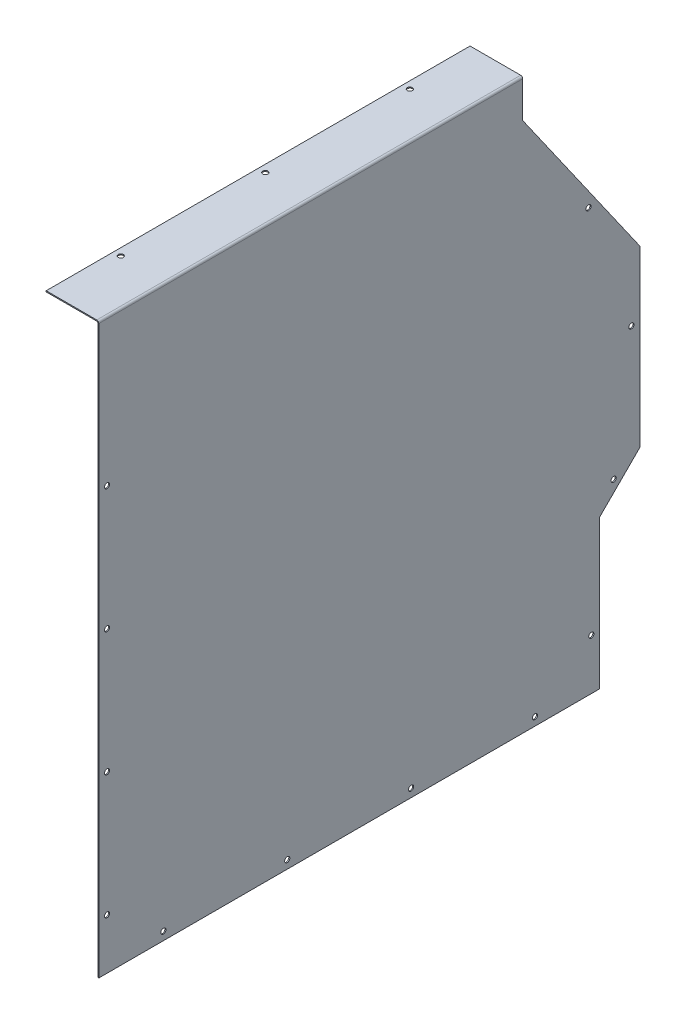
ISO-10303-21;
HEADER;
FILE_DESCRIPTION(('STEP AP214'),'2;1');
FILE_NAME('part.step','',(''),(''),'','','');
FILE_SCHEMA(('AUTOMOTIVE_DESIGN { 1 0 10303 214 1 1 1 1 }'));
ENDSEC;
DATA;
#1=APPLICATION_CONTEXT('core data for automotive mechanical design processes');
#2=APPLICATION_PROTOCOL_DEFINITION('international standard','automotive_design',2000,#1);
#3=PRODUCT_CONTEXT('',#1,'mechanical');
#4=PRODUCT('Part','Part','',(#3));
#5=PRODUCT_RELATED_PRODUCT_CATEGORY('part','',(#4));
#6=PRODUCT_DEFINITION_FORMATION('','',#4);
#7=PRODUCT_DEFINITION_CONTEXT('part definition',#1,'design');
#8=PRODUCT_DEFINITION('design','',#6,#7);
#9=PRODUCT_DEFINITION_SHAPE('','',#8);
#10=(LENGTH_UNIT() NAMED_UNIT(*) SI_UNIT(.MILLI.,.METRE.));
#11=(NAMED_UNIT(*) PLANE_ANGLE_UNIT() SI_UNIT($,.RADIAN.));
#12=(NAMED_UNIT(*) SI_UNIT($,.STERADIAN.) SOLID_ANGLE_UNIT());
#13=UNCERTAINTY_MEASURE_WITH_UNIT(LENGTH_MEASURE(1.E-05),#10,'distance_accuracy_value','');
#14=(GEOMETRIC_REPRESENTATION_CONTEXT(3) GLOBAL_UNCERTAINTY_ASSIGNED_CONTEXT((#13)) GLOBAL_UNIT_ASSIGNED_CONTEXT((#10,
#11,#12)) REPRESENTATION_CONTEXT('',''));
#15=CARTESIAN_POINT('',(0.,0.,0.));
#16=DIRECTION('',(0.,0.,1.));
#17=DIRECTION('',(1.,0.,0.));
#18=AXIS2_PLACEMENT_3D('',#15,#16,#17);
#19=CARTESIAN_POINT('',(1.,-275.5,262.));
#20=DIRECTION('',(0.,0.,-1.));
#21=DIRECTION('',(-1.,0.,0.));
#22=AXIS2_PLACEMENT_3D('',#19,#20,#21);
#23=PLANE('',#22);
#24=DIRECTION('',(1.,0.,0.));
#25=VECTOR('',#24,1.);
#26=CARTESIAN_POINT('',(0.,273.5,262.));
#27=LINE('',#26,#25);
#28=CARTESIAN_POINT('',(0.,273.5,262.));
#29=VERTEX_POINT('',#28);
#30=CARTESIAN_POINT('',(1.,273.5,262.));
#31=VERTEX_POINT('',#30);
#32=EDGE_CURVE('E160',#29,#31,#27,.T.);
#33=ORIENTED_EDGE('',*,*,#32,.F.);
#34=DIRECTION('',(0.,-1.,0.));
#35=VECTOR('',#34,1.);
#36=CARTESIAN_POINT('',(0.,-275.5,262.));
#37=LINE('',#36,#35);
#38=CARTESIAN_POINT('',(0.,-275.5,262.));
#39=VERTEX_POINT('',#38);
#40=EDGE_CURVE('E157',#29,#39,#37,.T.);
#41=ORIENTED_EDGE('',*,*,#40,.T.);
#42=DIRECTION('',(-1.,0.,0.));
#43=VECTOR('',#42,1.);
#44=CARTESIAN_POINT('',(1.,-275.5,262.));
#45=LINE('',#44,#43);
#46=CARTESIAN_POINT('',(1.,-275.5,262.));
#47=VERTEX_POINT('',#46);
#48=EDGE_CURVE('E13',#47,#39,#45,.T.);
#49=ORIENTED_EDGE('',*,*,#48,.F.);
#50=DIRECTION('',(0.,-1.,0.));
#51=VECTOR('',#50,1.);
#52=CARTESIAN_POINT('',(1.,-275.5,262.));
#53=LINE('',#52,#51);
#54=EDGE_CURVE('E117',#31,#47,#53,.T.);
#55=ORIENTED_EDGE('',*,*,#54,.F.);
#56=EDGE_LOOP('',(#33,#41,#49,#55));
#57=FACE_BOUND('',#56,.T.);
#58=ADVANCED_FACE('F59',(#57),#23,.F.);
#59=CARTESIAN_POINT('',(1.,238.5,-148.566378810027));
#60=DIRECTION('',(0.,0.,1.));
#61=DIRECTION('',(1.,0.,0.));
#62=AXIS2_PLACEMENT_3D('',#59,#60,#61);
#63=PLANE('',#62);
#64=DIRECTION('',(1.,0.,0.));
#65=VECTOR('',#64,1.);
#66=CARTESIAN_POINT('',(0.,273.5,-148.566378810027));
#67=LINE('',#66,#65);
#68=CARTESIAN_POINT('',(0.,273.5,-148.566378810027));
#69=VERTEX_POINT('',#68);
#70=CARTESIAN_POINT('',(0.999999999999997,273.5,-148.566378810027));
#71=VERTEX_POINT('',#70);
#72=EDGE_CURVE('E187',#69,#71,#67,.T.);
#73=ORIENTED_EDGE('',*,*,#72,.T.);
#74=DIRECTION('',(0.,1.,0.));
#75=VECTOR('',#74,1.);
#76=CARTESIAN_POINT('',(1.,238.5,-148.566378810027));
#77=LINE('',#76,#75);
#78=CARTESIAN_POINT('',(1.,238.5,-148.566378810027));
#79=VERTEX_POINT('',#78);
#80=EDGE_CURVE('E151',#79,#71,#77,.T.);
#81=ORIENTED_EDGE('',*,*,#80,.F.);
#82=DIRECTION('',(-1.,0.,0.));
#83=VECTOR('',#82,1.);
#84=CARTESIAN_POINT('',(1.,238.5,-148.566378810027));
#85=LINE('',#84,#83);
#86=CARTESIAN_POINT('',(0.,238.5,-148.566378810027));
#87=VERTEX_POINT('',#86);
#88=EDGE_CURVE('E156',#79,#87,#85,.T.);
#89=ORIENTED_EDGE('',*,*,#88,.T.);
#90=DIRECTION('',(0.,1.,0.));
#91=VECTOR('',#90,1.);
#92=CARTESIAN_POINT('',(0.,238.5,-148.566378810027));
#93=LINE('',#92,#91);
#94=EDGE_CURVE('E168',#87,#69,#93,.T.);
#95=ORIENTED_EDGE('',*,*,#94,.T.);
#96=EDGE_LOOP('',(#73,#81,#89,#95));
#97=FACE_BOUND('',#96,.T.);
#98=ADVANCED_FACE('F184',(#97),#63,.F.);
#99=CARTESIAN_POINT('',(1.,0.,0.));
#100=DIRECTION('',(-1.,0.,0.));
#101=DIRECTION('',(0.,0.,1.));
#102=AXIS2_PLACEMENT_3D('',#99,#100,#101);
#103=PLANE('',#102);
#104=CARTESIAN_POINT('',(1.,13.5000000000021,253.999999999999));
#105=DIRECTION('',(-1.,0.,0.));
#106=DIRECTION('',(0.,0.,1.));
#107=AXIS2_PLACEMENT_3D('',#104,#105,#106);
#108=CIRCLE('',#107,2.49999999999996);
#109=CARTESIAN_POINT('',(1.,13.5000000000021,256.499999999999));
#110=VERTEX_POINT('',#109);
#111=EDGE_CURVE('E386',#110,#110,#108,.F.);
#112=ORIENTED_EDGE('',*,*,#111,.F.);
#113=EDGE_LOOP('',(#112));
#114=FACE_BOUND('',#113,.T.);
#115=CARTESIAN_POINT('',(1.,-106.499999999998,253.999999999999));
#116=DIRECTION('',(-1.,0.,0.));
#117=DIRECTION('',(0.,0.,1.));
#118=AXIS2_PLACEMENT_3D('',#115,#116,#117);
#119=CIRCLE('',#118,2.49999999999997);
#120=CARTESIAN_POINT('',(1.,-106.499999999998,256.499999999999));
#121=VERTEX_POINT('',#120);
#122=EDGE_CURVE('E418',#121,#121,#119,.F.);
#123=ORIENTED_EDGE('',*,*,#122,.F.);
#124=EDGE_LOOP('',(#123));
#125=FACE_BOUND('',#124,.T.);
#126=CARTESIAN_POINT('',(1.,-226.499999999998,253.999999999999));
#127=DIRECTION('',(-1.,0.,0.));
#128=DIRECTION('',(0.,0.,1.));
#129=AXIS2_PLACEMENT_3D('',#126,#127,#128);
#130=CIRCLE('',#129,2.49999999999996);
#131=CARTESIAN_POINT('',(1.,-226.499999999998,256.499999999999));
#132=VERTEX_POINT('',#131);
#133=EDGE_CURVE('E414',#132,#132,#130,.F.);
#134=ORIENTED_EDGE('',*,*,#133,.F.);
#135=EDGE_LOOP('',(#134));
#136=FACE_BOUND('',#135,.T.);
#137=CARTESIAN_POINT('',(1.,-267.499999999996,199.5));
#138=DIRECTION('',(-1.,0.,0.));
#139=DIRECTION('',(0.,0.,1.));
#140=AXIS2_PLACEMENT_3D('',#137,#138,#139);
#141=CIRCLE('',#140,2.5);
#142=CARTESIAN_POINT('',(1.,-267.499999999996,202.));
#143=VERTEX_POINT('',#142);
#144=EDGE_CURVE('E410',#143,#143,#141,.F.);
#145=ORIENTED_EDGE('',*,*,#144,.F.);
#146=EDGE_LOOP('',(#145));
#147=FACE_BOUND('',#146,.T.);
#148=CARTESIAN_POINT('',(1.,-267.499999999996,79.5000000000002));
#149=DIRECTION('',(-1.,0.,0.));
#150=DIRECTION('',(0.,0.,1.));
#151=AXIS2_PLACEMENT_3D('',#148,#149,#150);
#152=CIRCLE('',#151,2.49999999999997);
#153=CARTESIAN_POINT('',(1.,-267.499999999996,82.0000000000002));
#154=VERTEX_POINT('',#153);
#155=EDGE_CURVE('E406',#154,#154,#152,.F.);
#156=ORIENTED_EDGE('',*,*,#155,.F.);
#157=EDGE_LOOP('',(#156));
#158=FACE_BOUND('',#157,.T.);
#159=CARTESIAN_POINT('',(1.,-267.499999999996,-40.4999999999998));
#160=DIRECTION('',(-1.,0.,0.));
#161=DIRECTION('',(0.,0.,1.));
#162=AXIS2_PLACEMENT_3D('',#159,#160,#161);
#163=CIRCLE('',#162,2.5);
#164=CARTESIAN_POINT('',(1.,-267.499999999996,-37.9999999999998));
#165=VERTEX_POINT('',#164);
#166=EDGE_CURVE('E402',#165,#165,#163,.F.);
#167=ORIENTED_EDGE('',*,*,#166,.F.);
#168=EDGE_LOOP('',(#167));
#169=FACE_BOUND('',#168,.T.);
#170=CARTESIAN_POINT('',(1.,-267.499999999996,-160.5));
#171=DIRECTION('',(-1.,0.,0.));
#172=DIRECTION('',(0.,0.,1.));
#173=AXIS2_PLACEMENT_3D('',#170,#171,#172);
#174=CIRCLE('',#173,2.5);
#175=CARTESIAN_POINT('',(1.,-267.499999999996,-158.));
#176=VERTEX_POINT('',#175);
#177=EDGE_CURVE('E398',#176,#176,#174,.F.);
#178=ORIENTED_EDGE('',*,*,#177,.F.);
#179=EDGE_LOOP('',(#178));
#180=FACE_BOUND('',#179,.T.);
#181=CARTESIAN_POINT('',(1.,-106.5,-236.686291501008));
#182=DIRECTION('',(-1.,0.,0.));
#183=DIRECTION('',(0.,0.,1.));
#184=AXIS2_PLACEMENT_3D('',#181,#182,#183);
#185=CIRCLE('',#184,2.50000000000226);
#186=CARTESIAN_POINT('',(1.,-106.5,-234.186291501005));
#187=VERTEX_POINT('',#186);
#188=EDGE_CURVE('E393',#187,#187,#185,.F.);
#189=ORIENTED_EDGE('',*,*,#188,.F.);
#190=EDGE_LOOP('',(#189));
#191=FACE_BOUND('',#190,.T.);
#192=CARTESIAN_POINT('',(1.,-226.5,-214.999999999991));
#193=DIRECTION('',(-1.,0.,0.));
#194=DIRECTION('',(0.,0.,1.));
#195=AXIS2_PLACEMENT_3D('',#192,#193,#194);
#196=CIRCLE('',#195,2.500000000002);
#197=CARTESIAN_POINT('',(1.,-226.5,-212.499999999989));
#198=VERTEX_POINT('',#197);
#199=EDGE_CURVE('E397',#198,#198,#196,.F.);
#200=ORIENTED_EDGE('',*,*,#199,.F.);
#201=EDGE_LOOP('',(#200));
#202=FACE_BOUND('',#201,.T.);
#203=CARTESIAN_POINT('',(1.,13.4999999999995,-253.890872965255));
#204=DIRECTION('',(-1.,0.,0.));
#205=DIRECTION('',(0.,0.,1.));
#206=AXIS2_PLACEMENT_3D('',#203,#204,#205);
#207=CIRCLE('',#206,2.50000000000246);
#208=CARTESIAN_POINT('',(1.,13.4999999999995,-251.390872965253));
#209=VERTEX_POINT('',#208);
#210=EDGE_CURVE('E428',#209,#209,#207,.F.);
#211=ORIENTED_EDGE('',*,*,#210,.F.);
#212=EDGE_LOOP('',(#211));
#213=FACE_BOUND('',#212,.T.);
#214=CARTESIAN_POINT('',(1.,133.500000000002,-212.321973611953));
#215=DIRECTION('',(-1.,0.,0.));
#216=DIRECTION('',(0.,0.,1.));
#217=AXIS2_PLACEMENT_3D('',#214,#215,#216);
#218=CIRCLE('',#217,2.50000000000049);
#219=CARTESIAN_POINT('',(1.,133.500000000002,-209.821973611953));
#220=VERTEX_POINT('',#219);
#221=EDGE_CURVE('E423',#220,#220,#218,.F.);
#222=ORIENTED_EDGE('',*,*,#221,.F.);
#223=EDGE_LOOP('',(#222));
#224=FACE_BOUND('',#223,.T.);
#225=CARTESIAN_POINT('',(1.,133.500000000002,253.999999999999));
#226=DIRECTION('',(-1.,0.,0.));
#227=DIRECTION('',(0.,0.,1.));
#228=AXIS2_PLACEMENT_3D('',#225,#226,#227);
#229=CIRCLE('',#228,2.49999999999996);
#230=CARTESIAN_POINT('',(1.,133.500000000002,256.499999999999));
#231=VERTEX_POINT('',#230);
#232=EDGE_CURVE('E254',#231,#231,#229,.F.);
#233=ORIENTED_EDGE('',*,*,#232,.F.);
#234=EDGE_LOOP('',(#233));
#235=FACE_BOUND('',#234,.T.);
#236=DIRECTION('',(0.,0.,-1.));
#237=VECTOR('',#236,1.);
#238=CARTESIAN_POINT('',(0.999999999999997,273.5,-148.566378810027));
#239=LINE('',#238,#237);
#240=EDGE_CURVE('E189',#71,#31,#239,.F.);
#241=ORIENTED_EDGE('',*,*,#240,.T.);
#242=ORIENTED_EDGE('',*,*,#54,.T.);
#243=DIRECTION('',(0.,0.,-1.));
#244=VECTOR('',#243,1.);
#245=CARTESIAN_POINT('',(1.,-275.5,262.));
#246=LINE('',#245,#244);
#247=CARTESIAN_POINT('',(1.,-275.5,-223.));
#248=VERTEX_POINT('',#247);
#249=EDGE_CURVE('E267',#47,#248,#246,.T.);
#250=ORIENTED_EDGE('',*,*,#249,.T.);
#251=DIRECTION('',(0.,1.,0.));
#252=VECTOR('',#251,1.);
#253=CARTESIAN_POINT('',(1.,-275.5,-223.));
#254=LINE('',#253,#252);
#255=CARTESIAN_POINT('',(1.,-131.5,-223.));
#256=VERTEX_POINT('',#255);
#257=EDGE_CURVE('E134',#248,#256,#254,.T.);
#258=ORIENTED_EDGE('',*,*,#257,.T.);
#259=DIRECTION('',(0.,0.707106781186546,-0.707106781186549));
#260=VECTOR('',#259,1.);
#261=CARTESIAN_POINT('',(1.,-131.5,-223.));
#262=LINE('',#261,#260);
#263=CARTESIAN_POINT('',(1.,-92.5000000000001,-262.));
#264=VERTEX_POINT('',#263);
#265=EDGE_CURVE('E127',#256,#264,#262,.T.);
#266=ORIENTED_EDGE('',*,*,#265,.T.);
#267=DIRECTION('',(0.,1.,0.));
#268=VECTOR('',#267,1.);
#269=CARTESIAN_POINT('',(1.,-92.5000000000001,-262.));
#270=LINE('',#269,#268);
#271=CARTESIAN_POINT('',(1.,76.5,-262.));
#272=VERTEX_POINT('',#271);
#273=EDGE_CURVE('E131',#264,#272,#270,.T.);
#274=ORIENTED_EDGE('',*,*,#273,.T.);
#275=DIRECTION('',(0.,0.819152044288991,0.573576436351048));
#276=VECTOR('',#275,1.);
#277=CARTESIAN_POINT('',(1.,76.5,-262.));
#278=LINE('',#277,#276);
#279=EDGE_CURVE('E82',#272,#79,#278,.T.);
#280=ORIENTED_EDGE('',*,*,#279,.T.);
#281=ORIENTED_EDGE('',*,*,#80,.T.);
#282=EDGE_LOOP('',(#241,#242,#250,#258,#266,#274,#280,#281));
#283=FACE_BOUND('',#282,.T.);
#284=ADVANCED_FACE('F129',(#114,#125,#136,#147,#158,#169,#180,#191,#202,#213,#224,#235,#283),
#103,.F.);
#285=CARTESIAN_POINT('',(0.,0.,0.));
#286=DIRECTION('',(-1.,0.,0.));
#287=DIRECTION('',(0.,0.,1.));
#288=AXIS2_PLACEMENT_3D('',#285,#286,#287);
#289=PLANE('',#288);
#290=CARTESIAN_POINT('',(0.,13.5000000000021,253.999999999999));
#291=DIRECTION('',(-1.,0.,0.));
#292=DIRECTION('',(0.,0.,1.));
#293=AXIS2_PLACEMENT_3D('',#290,#291,#292);
#294=CIRCLE('',#293,2.49999999999996);
#295=CARTESIAN_POINT('',(0.,13.5000000000021,256.499999999999));
#296=VERTEX_POINT('',#295);
#297=EDGE_CURVE('E341',#296,#296,#294,.T.);
#298=ORIENTED_EDGE('',*,*,#297,.F.);
#299=EDGE_LOOP('',(#298));
#300=FACE_BOUND('',#299,.T.);
#301=CARTESIAN_POINT('',(0.,-106.499999999998,253.999999999999));
#302=DIRECTION('',(-1.,0.,0.));
#303=DIRECTION('',(0.,0.,1.));
#304=AXIS2_PLACEMENT_3D('',#301,#302,#303);
#305=CIRCLE('',#304,2.49999999999997);
#306=CARTESIAN_POINT('',(0.,-106.499999999998,256.499999999999));
#307=VERTEX_POINT('',#306);
#308=EDGE_CURVE('E345',#307,#307,#305,.T.);
#309=ORIENTED_EDGE('',*,*,#308,.F.);
#310=EDGE_LOOP('',(#309));
#311=FACE_BOUND('',#310,.T.);
#312=CARTESIAN_POINT('',(0.,-226.499999999998,253.999999999999));
#313=DIRECTION('',(-1.,0.,0.));
#314=DIRECTION('',(0.,0.,1.));
#315=AXIS2_PLACEMENT_3D('',#312,#313,#314);
#316=CIRCLE('',#315,2.49999999999996);
#317=CARTESIAN_POINT('',(0.,-226.499999999998,256.499999999999));
#318=VERTEX_POINT('',#317);
#319=EDGE_CURVE('E349',#318,#318,#316,.T.);
#320=ORIENTED_EDGE('',*,*,#319,.F.);
#321=EDGE_LOOP('',(#320));
#322=FACE_BOUND('',#321,.T.);
#323=CARTESIAN_POINT('',(0.,-267.499999999996,199.5));
#324=DIRECTION('',(-1.,0.,0.));
#325=DIRECTION('',(0.,0.,1.));
#326=AXIS2_PLACEMENT_3D('',#323,#324,#325);
#327=CIRCLE('',#326,2.5);
#328=CARTESIAN_POINT('',(0.,-267.499999999996,202.));
#329=VERTEX_POINT('',#328);
#330=EDGE_CURVE('E353',#329,#329,#327,.T.);
#331=ORIENTED_EDGE('',*,*,#330,.F.);
#332=EDGE_LOOP('',(#331));
#333=FACE_BOUND('',#332,.T.);
#334=CARTESIAN_POINT('',(0.,-267.499999999996,79.5000000000002));
#335=DIRECTION('',(-1.,0.,0.));
#336=DIRECTION('',(0.,0.,1.));
#337=AXIS2_PLACEMENT_3D('',#334,#335,#336);
#338=CIRCLE('',#337,2.49999999999997);
#339=CARTESIAN_POINT('',(0.,-267.499999999996,82.0000000000002));
#340=VERTEX_POINT('',#339);
#341=EDGE_CURVE('E357',#340,#340,#338,.T.);
#342=ORIENTED_EDGE('',*,*,#341,.F.);
#343=EDGE_LOOP('',(#342));
#344=FACE_BOUND('',#343,.T.);
#345=CARTESIAN_POINT('',(0.,-267.499999999996,-40.4999999999998));
#346=DIRECTION('',(-1.,0.,0.));
#347=DIRECTION('',(0.,0.,1.));
#348=AXIS2_PLACEMENT_3D('',#345,#346,#347);
#349=CIRCLE('',#348,2.5);
#350=CARTESIAN_POINT('',(0.,-267.499999999996,-37.9999999999998));
#351=VERTEX_POINT('',#350);
#352=EDGE_CURVE('E361',#351,#351,#349,.T.);
#353=ORIENTED_EDGE('',*,*,#352,.F.);
#354=EDGE_LOOP('',(#353));
#355=FACE_BOUND('',#354,.T.);
#356=CARTESIAN_POINT('',(0.,-267.499999999996,-160.5));
#357=DIRECTION('',(-1.,0.,0.));
#358=DIRECTION('',(0.,0.,1.));
#359=AXIS2_PLACEMENT_3D('',#356,#357,#358);
#360=CIRCLE('',#359,2.5);
#361=CARTESIAN_POINT('',(0.,-267.499999999996,-158.));
#362=VERTEX_POINT('',#361);
#363=EDGE_CURVE('E365',#362,#362,#360,.T.);
#364=ORIENTED_EDGE('',*,*,#363,.F.);
#365=EDGE_LOOP('',(#364));
#366=FACE_BOUND('',#365,.T.);
#367=CARTESIAN_POINT('',(0.,-106.5,-236.686291501008));
#368=DIRECTION('',(-1.,0.,0.));
#369=DIRECTION('',(0.,0.,1.));
#370=AXIS2_PLACEMENT_3D('',#367,#368,#369);
#371=CIRCLE('',#370,2.50000000000226);
#372=CARTESIAN_POINT('',(0.,-106.5,-234.186291501005));
#373=VERTEX_POINT('',#372);
#374=EDGE_CURVE('E369',#373,#373,#371,.T.);
#375=ORIENTED_EDGE('',*,*,#374,.F.);
#376=EDGE_LOOP('',(#375));
#377=FACE_BOUND('',#376,.T.);
#378=CARTESIAN_POINT('',(0.,-226.5,-214.999999999991));
#379=DIRECTION('',(-1.,0.,0.));
#380=DIRECTION('',(0.,0.,1.));
#381=AXIS2_PLACEMENT_3D('',#378,#379,#380);
#382=CIRCLE('',#381,2.500000000002);
#383=CARTESIAN_POINT('',(0.,-226.5,-212.499999999989));
#384=VERTEX_POINT('',#383);
#385=EDGE_CURVE('E373',#384,#384,#382,.T.);
#386=ORIENTED_EDGE('',*,*,#385,.F.);
#387=EDGE_LOOP('',(#386));
#388=FACE_BOUND('',#387,.T.);
#389=CARTESIAN_POINT('',(0.,13.4999999999995,-253.890872965255));
#390=DIRECTION('',(-1.,0.,0.));
#391=DIRECTION('',(0.,0.,1.));
#392=AXIS2_PLACEMENT_3D('',#389,#390,#391);
#393=CIRCLE('',#392,2.50000000000246);
#394=CARTESIAN_POINT('',(0.,13.4999999999995,-251.390872965253));
#395=VERTEX_POINT('',#394);
#396=EDGE_CURVE('E377',#395,#395,#393,.T.);
#397=ORIENTED_EDGE('',*,*,#396,.F.);
#398=EDGE_LOOP('',(#397));
#399=FACE_BOUND('',#398,.T.);
#400=CARTESIAN_POINT('',(0.,133.500000000002,-212.321973611953));
#401=DIRECTION('',(-1.,0.,0.));
#402=DIRECTION('',(0.,0.,1.));
#403=AXIS2_PLACEMENT_3D('',#400,#401,#402);
#404=CIRCLE('',#403,2.50000000000049);
#405=CARTESIAN_POINT('',(0.,133.500000000002,-209.821973611953));
#406=VERTEX_POINT('',#405);
#407=EDGE_CURVE('E381',#406,#406,#404,.T.);
#408=ORIENTED_EDGE('',*,*,#407,.F.);
#409=EDGE_LOOP('',(#408));
#410=FACE_BOUND('',#409,.T.);
#411=CARTESIAN_POINT('',(0.,133.500000000002,253.999999999999));
#412=DIRECTION('',(-1.,0.,0.));
#413=DIRECTION('',(0.,0.,1.));
#414=AXIS2_PLACEMENT_3D('',#411,#412,#413);
#415=CIRCLE('',#414,2.49999999999996);
#416=CARTESIAN_POINT('',(0.,133.500000000002,256.499999999999));
#417=VERTEX_POINT('',#416);
#418=EDGE_CURVE('E384',#417,#417,#415,.T.);
#419=ORIENTED_EDGE('',*,*,#418,.F.);
#420=EDGE_LOOP('',(#419));
#421=FACE_BOUND('',#420,.T.);
#422=ORIENTED_EDGE('',*,*,#40,.F.);
#423=DIRECTION('',(0.,0.,-1.));
#424=VECTOR('',#423,1.);
#425=CARTESIAN_POINT('',(0.,273.5,-148.566378810027));
#426=LINE('',#425,#424);
#427=EDGE_CURVE('E73',#69,#29,#426,.F.);
#428=ORIENTED_EDGE('',*,*,#427,.F.);
#429=ORIENTED_EDGE('',*,*,#94,.F.);
#430=DIRECTION('',(0.,0.819152044288991,0.573576436351048));
#431=VECTOR('',#430,1.);
#432=CARTESIAN_POINT('',(0.,76.5,-262.));
#433=LINE('',#432,#431);
#434=CARTESIAN_POINT('',(0.,76.5,-262.));
#435=VERTEX_POINT('',#434);
#436=EDGE_CURVE('E109',#435,#87,#433,.T.);
#437=ORIENTED_EDGE('',*,*,#436,.F.);
#438=DIRECTION('',(0.,1.,0.));
#439=VECTOR('',#438,1.);
#440=CARTESIAN_POINT('',(0.,-92.5000000000001,-262.));
#441=LINE('',#440,#439);
#442=CARTESIAN_POINT('',(0.,-92.5000000000001,-262.));
#443=VERTEX_POINT('',#442);
#444=EDGE_CURVE('E165',#443,#435,#441,.T.);
#445=ORIENTED_EDGE('',*,*,#444,.F.);
#446=DIRECTION('',(0.,0.707106781186546,-0.707106781186549));
#447=VECTOR('',#446,1.);
#448=CARTESIAN_POINT('',(0.,-131.5,-223.));
#449=LINE('',#448,#447);
#450=CARTESIAN_POINT('',(0.,-131.5,-223.));
#451=VERTEX_POINT('',#450);
#452=EDGE_CURVE('E143',#451,#443,#449,.T.);
#453=ORIENTED_EDGE('',*,*,#452,.F.);
#454=DIRECTION('',(0.,1.,0.));
#455=VECTOR('',#454,1.);
#456=CARTESIAN_POINT('',(0.,-275.5,-223.));
#457=LINE('',#456,#455);
#458=CARTESIAN_POINT('',(0.,-275.5,-223.));
#459=VERTEX_POINT('',#458);
#460=EDGE_CURVE('E162',#459,#451,#457,.T.);
#461=ORIENTED_EDGE('',*,*,#460,.F.);
#462=DIRECTION('',(0.,0.,-1.));
#463=VECTOR('',#462,1.);
#464=CARTESIAN_POINT('',(0.,-275.5,262.));
#465=LINE('',#464,#463);
#466=EDGE_CURVE('E159',#39,#459,#465,.T.);
#467=ORIENTED_EDGE('',*,*,#466,.F.);
#468=EDGE_LOOP('',(#422,#428,#429,#437,#445,#453,#461,#467));
#469=FACE_BOUND('',#468,.T.);
#470=ADVANCED_FACE('F179',(#300,#311,#322,#333,#344,#355,#366,#377,#388,#399,#410,#421,#469),
#289,.T.);
#471=CARTESIAN_POINT('',(1.,-275.5,262.));
#472=DIRECTION('',(0.,1.,0.));
#473=DIRECTION('',(0.,0.,1.));
#474=AXIS2_PLACEMENT_3D('',#471,#472,#473);
#475=PLANE('',#474);
#476=ORIENTED_EDGE('',*,*,#466,.T.);
#477=DIRECTION('',(-1.,0.,0.));
#478=VECTOR('',#477,1.);
#479=CARTESIAN_POINT('',(1.,-275.5,-223.));
#480=LINE('',#479,#478);
#481=EDGE_CURVE('E66',#248,#459,#480,.T.);
#482=ORIENTED_EDGE('',*,*,#481,.F.);
#483=ORIENTED_EDGE('',*,*,#249,.F.);
#484=ORIENTED_EDGE('',*,*,#48,.T.);
#485=EDGE_LOOP('',(#476,#482,#483,#484));
#486=FACE_BOUND('',#485,.T.);
#487=ADVANCED_FACE('F269',(#486),#475,.F.);
#488=CARTESIAN_POINT('',(1.,-275.5,-223.));
#489=DIRECTION('',(0.,0.,1.));
#490=DIRECTION('',(1.,0.,0.));
#491=AXIS2_PLACEMENT_3D('',#488,#489,#490);
#492=PLANE('',#491);
#493=ORIENTED_EDGE('',*,*,#460,.T.);
#494=DIRECTION('',(-1.,0.,0.));
#495=VECTOR('',#494,1.);
#496=CARTESIAN_POINT('',(1.,-131.5,-223.));
#497=LINE('',#496,#495);
#498=EDGE_CURVE('E146',#256,#451,#497,.T.);
#499=ORIENTED_EDGE('',*,*,#498,.F.);
#500=ORIENTED_EDGE('',*,*,#257,.F.);
#501=ORIENTED_EDGE('',*,*,#481,.T.);
#502=EDGE_LOOP('',(#493,#499,#500,#501));
#503=FACE_BOUND('',#502,.T.);
#504=ADVANCED_FACE('F176',(#503),#492,.F.);
#505=CARTESIAN_POINT('',(1.,-131.5,-223.));
#506=DIRECTION('',(0.,0.707106781186549,0.707106781186546));
#507=DIRECTION('',(0.,-0.707106781186546,0.707106781186549));
#508=AXIS2_PLACEMENT_3D('',#505,#506,#507);
#509=PLANE('',#508);
#510=ORIENTED_EDGE('',*,*,#452,.T.);
#511=DIRECTION('',(-1.,0.,0.));
#512=VECTOR('',#511,1.);
#513=CARTESIAN_POINT('',(1.,-92.5000000000001,-262.));
#514=LINE('',#513,#512);
#515=EDGE_CURVE('E140',#264,#443,#514,.T.);
#516=ORIENTED_EDGE('',*,*,#515,.F.);
#517=ORIENTED_EDGE('',*,*,#265,.F.);
#518=ORIENTED_EDGE('',*,*,#498,.T.);
#519=EDGE_LOOP('',(#510,#516,#517,#518));
#520=FACE_BOUND('',#519,.T.);
#521=ADVANCED_FACE('F141',(#520),#509,.F.);
#522=CARTESIAN_POINT('',(1.,-92.5000000000001,-262.));
#523=DIRECTION('',(0.,0.,1.));
#524=DIRECTION('',(1.,0.,0.));
#525=AXIS2_PLACEMENT_3D('',#522,#523,#524);
#526=PLANE('',#525);
#527=ORIENTED_EDGE('',*,*,#444,.T.);
#528=DIRECTION('',(-1.,0.,0.));
#529=VECTOR('',#528,1.);
#530=CARTESIAN_POINT('',(1.,76.5,-262.));
#531=LINE('',#530,#529);
#532=EDGE_CURVE('E147',#272,#435,#531,.T.);
#533=ORIENTED_EDGE('',*,*,#532,.F.);
#534=ORIENTED_EDGE('',*,*,#273,.F.);
#535=ORIENTED_EDGE('',*,*,#515,.T.);
#536=EDGE_LOOP('',(#527,#533,#534,#535));
#537=FACE_BOUND('',#536,.T.);
#538=ADVANCED_FACE('F149',(#537),#526,.F.);
#539=CARTESIAN_POINT('',(1.,76.5,-262.));
#540=DIRECTION('',(0.,-0.573576436351048,0.819152044288991));
#541=DIRECTION('',(0.,-0.819152044288991,-0.573576436351048));
#542=AXIS2_PLACEMENT_3D('',#539,#540,#541);
#543=PLANE('',#542);
#544=ORIENTED_EDGE('',*,*,#436,.T.);
#545=ORIENTED_EDGE('',*,*,#88,.F.);
#546=ORIENTED_EDGE('',*,*,#279,.F.);
#547=ORIENTED_EDGE('',*,*,#532,.T.);
#548=EDGE_LOOP('',(#544,#545,#546,#547));
#549=FACE_BOUND('',#548,.T.);
#550=ADVANCED_FACE('F180',(#549),#543,.F.);
#551=CARTESIAN_POINT('',(-1.,273.5,262.));
#552=DIRECTION('',(0.,0.,1.));
#553=DIRECTION('',(1.,0.,0.));
#554=AXIS2_PLACEMENT_3D('',#551,#552,#553);
#555=PLANE('',#554);
#556=DIRECTION('',(0.,-1.,0.));
#557=VECTOR('',#556,1.);
#558=CARTESIAN_POINT('',(-0.999999999999998,275.5,262.));
#559=LINE('',#558,#557);
#560=CARTESIAN_POINT('',(-1.,274.5,262.));
#561=VERTEX_POINT('',#560);
#562=CARTESIAN_POINT('',(-0.999999999999997,275.5,262.));
#563=VERTEX_POINT('',#562);
#564=EDGE_CURVE('E219',#561,#563,#559,.F.);
#565=ORIENTED_EDGE('',*,*,#564,.F.);
#566=CARTESIAN_POINT('',(-1.,273.5,262.));
#567=DIRECTION('',(0.,0.,-1.));
#568=DIRECTION('',(-1.,0.,0.));
#569=AXIS2_PLACEMENT_3D('',#566,#567,#568);
#570=CIRCLE('',#569,1.);
#571=EDGE_CURVE('E213',#29,#561,#570,.F.);
#572=ORIENTED_EDGE('',*,*,#571,.F.);
#573=ORIENTED_EDGE('',*,*,#32,.T.);
#574=CARTESIAN_POINT('',(-1.,273.5,262.));
#575=DIRECTION('',(0.,0.,-1.));
#576=DIRECTION('',(-1.,0.,0.));
#577=AXIS2_PLACEMENT_3D('',#574,#575,#576);
#578=CIRCLE('',#577,2.);
#579=EDGE_CURVE('E256',#31,#563,#578,.F.);
#580=ORIENTED_EDGE('',*,*,#579,.T.);
#581=EDGE_LOOP('',(#565,#572,#573,#580));
#582=FACE_BOUND('',#581,.T.);
#583=ADVANCED_FACE('F272',(#582),#555,.T.);
#584=CARTESIAN_POINT('',(-1.,273.5,-148.566378810027));
#585=DIRECTION('',(0.,0.,1.));
#586=DIRECTION('',(1.,0.,0.));
#587=AXIS2_PLACEMENT_3D('',#584,#585,#586);
#588=PLANE('',#587);
#589=CARTESIAN_POINT('',(-1.,273.5,-148.566378810027));
#590=DIRECTION('',(0.,0.,-1.));
#591=DIRECTION('',(-1.,0.,0.));
#592=AXIS2_PLACEMENT_3D('',#589,#590,#591);
#593=CIRCLE('',#592,1.);
#594=CARTESIAN_POINT('',(-1.,274.5,-148.566378810027));
#595=VERTEX_POINT('',#594);
#596=EDGE_CURVE('E211',#595,#69,#593,.T.);
#597=ORIENTED_EDGE('',*,*,#596,.F.);
#598=DIRECTION('',(0.,-1.,0.));
#599=VECTOR('',#598,1.);
#600=CARTESIAN_POINT('',(-1.,274.5,-148.566378810027));
#601=LINE('',#600,#599);
#602=CARTESIAN_POINT('',(-0.999999999999998,275.5,-148.566378810027));
#603=VERTEX_POINT('',#602);
#604=EDGE_CURVE('E218',#595,#603,#601,.F.);
#605=ORIENTED_EDGE('',*,*,#604,.T.);
#606=CARTESIAN_POINT('',(-1.,273.5,-148.566378810027));
#607=DIRECTION('',(0.,0.,-1.));
#608=DIRECTION('',(-1.,0.,0.));
#609=AXIS2_PLACEMENT_3D('',#606,#607,#608);
#610=CIRCLE('',#609,2.);
#611=EDGE_CURVE('E257',#603,#71,#610,.T.);
#612=ORIENTED_EDGE('',*,*,#611,.T.);
#613=ORIENTED_EDGE('',*,*,#72,.F.);
#614=EDGE_LOOP('',(#597,#605,#612,#613));
#615=FACE_BOUND('',#614,.T.);
#616=ADVANCED_FACE('F224',(#615),#588,.F.);
#617=CARTESIAN_POINT('',(-1.,273.5,-148.566378810027));
#618=DIRECTION('',(0.,0.,-1.));
#619=DIRECTION('',(0.,1.,0.));
#620=AXIS2_PLACEMENT_3D('',#617,#618,#619);
#621=CYLINDRICAL_SURFACE('',#620,2.);
#622=ORIENTED_EDGE('',*,*,#240,.F.);
#623=ORIENTED_EDGE('',*,*,#611,.F.);
#624=DIRECTION('',(0.,0.,-1.));
#625=VECTOR('',#624,1.);
#626=CARTESIAN_POINT('',(-0.999999999999998,275.5,262.));
#627=LINE('',#626,#625);
#628=EDGE_CURVE('E240',#603,#563,#627,.F.);
#629=ORIENTED_EDGE('',*,*,#628,.T.);
#630=ORIENTED_EDGE('',*,*,#579,.F.);
#631=EDGE_LOOP('',(#622,#623,#629,#630));
#632=FACE_BOUND('',#631,.T.);
#633=ADVANCED_FACE('F302',(#632),#621,.T.);
#634=CARTESIAN_POINT('',(-1.,273.5,-148.566378810027));
#635=DIRECTION('',(0.,0.,-1.));
#636=DIRECTION('',(0.,1.,0.));
#637=AXIS2_PLACEMENT_3D('',#634,#635,#636);
#638=CYLINDRICAL_SURFACE('',#637,1.);
#639=ORIENTED_EDGE('',*,*,#427,.T.);
#640=ORIENTED_EDGE('',*,*,#571,.T.);
#641=DIRECTION('',(0.,0.,-1.));
#642=VECTOR('',#641,1.);
#643=CARTESIAN_POINT('',(-1.,274.5,262.));
#644=LINE('',#643,#642);
#645=EDGE_CURVE('E208',#561,#595,#644,.T.);
#646=ORIENTED_EDGE('',*,*,#645,.T.);
#647=ORIENTED_EDGE('',*,*,#596,.T.);
#648=EDGE_LOOP('',(#639,#640,#646,#647));
#649=FACE_BOUND('',#648,.T.);
#650=ADVANCED_FACE('F210',(#649),#638,.F.);
#651=CARTESIAN_POINT('',(-50.,275.5,-148.566378810027));
#652=DIRECTION('',(0.,0.,1.));
#653=DIRECTION('',(1.,0.,0.));
#654=AXIS2_PLACEMENT_3D('',#651,#652,#653);
#655=PLANE('',#654);
#656=ORIENTED_EDGE('',*,*,#604,.F.);
#657=DIRECTION('',(1.,0.,0.));
#658=VECTOR('',#657,1.);
#659=CARTESIAN_POINT('',(-50.,274.5,-148.566378810027));
#660=LINE('',#659,#658);
#661=CARTESIAN_POINT('',(-50.,274.5,-148.566378810027));
#662=VERTEX_POINT('',#661);
#663=EDGE_CURVE('E236',#595,#662,#660,.F.);
#664=ORIENTED_EDGE('',*,*,#663,.T.);
#665=DIRECTION('',(0.,-1.,0.));
#666=VECTOR('',#665,1.);
#667=CARTESIAN_POINT('',(-50.,275.5,-148.566378810027));
#668=LINE('',#667,#666);
#669=CARTESIAN_POINT('',(-50.,275.5,-148.566378810027));
#670=VERTEX_POINT('',#669);
#671=EDGE_CURVE('E228',#670,#662,#668,.T.);
#672=ORIENTED_EDGE('',*,*,#671,.F.);
#673=DIRECTION('',(-1.,0.,0.));
#674=VECTOR('',#673,1.);
#675=CARTESIAN_POINT('',(1.58085806895183E-12,275.5,-148.566378810027));
#676=LINE('',#675,#674);
#677=EDGE_CURVE('E239',#603,#670,#676,.T.);
#678=ORIENTED_EDGE('',*,*,#677,.F.);
#679=EDGE_LOOP('',(#656,#664,#672,#678));
#680=FACE_BOUND('',#679,.T.);
#681=ADVANCED_FACE('F233',(#680),#655,.F.);
#682=CARTESIAN_POINT('',(0.,275.5,262.));
#683=DIRECTION('',(0.,0.,-1.));
#684=DIRECTION('',(-1.,0.,0.));
#685=AXIS2_PLACEMENT_3D('',#682,#683,#684);
#686=PLANE('',#685);
#687=ORIENTED_EDGE('',*,*,#564,.T.);
#688=DIRECTION('',(1.,0.,0.));
#689=VECTOR('',#688,1.);
#690=CARTESIAN_POINT('',(9.21090811191535E-13,275.5,262.));
#691=LINE('',#690,#689);
#692=CARTESIAN_POINT('',(-50.,275.5,262.));
#693=VERTEX_POINT('',#692);
#694=EDGE_CURVE('E279',#693,#563,#691,.T.);
#695=ORIENTED_EDGE('',*,*,#694,.F.);
#696=DIRECTION('',(0.,-1.,0.));
#697=VECTOR('',#696,1.);
#698=CARTESIAN_POINT('',(-50.,275.5,262.));
#699=LINE('',#698,#697);
#700=CARTESIAN_POINT('',(-50.,274.5,262.));
#701=VERTEX_POINT('',#700);
#702=EDGE_CURVE('E286',#693,#701,#699,.T.);
#703=ORIENTED_EDGE('',*,*,#702,.T.);
#704=DIRECTION('',(-1.,0.,0.));
#705=VECTOR('',#704,1.);
#706=CARTESIAN_POINT('',(0.,274.5,262.));
#707=LINE('',#706,#705);
#708=EDGE_CURVE('E247',#701,#561,#707,.F.);
#709=ORIENTED_EDGE('',*,*,#708,.T.);
#710=EDGE_LOOP('',(#687,#695,#703,#709));
#711=FACE_BOUND('',#710,.T.);
#712=ADVANCED_FACE('F277',(#711),#686,.F.);
#713=CARTESIAN_POINT('',(9.21090811191535E-13,275.5,0.));
#714=DIRECTION('',(0.,-1.,0.));
#715=DIRECTION('',(1.,0.,0.));
#716=AXIS2_PLACEMENT_3D('',#713,#714,#715);
#717=PLANE('',#716);
#718=CARTESIAN_POINT('',(-43.,275.5,196.716810594987));
#719=DIRECTION('',(0.,1.,0.));
#720=DIRECTION('',(-1.,0.,0.));
#721=AXIS2_PLACEMENT_3D('',#718,#719,#720);
#722=CIRCLE('',#721,2.5);
#723=CARTESIAN_POINT('',(-45.5,275.5,196.716810594987));
#724=VERTEX_POINT('',#723);
#725=EDGE_CURVE('E427',#724,#724,#722,.T.);
#726=ORIENTED_EDGE('',*,*,#725,.F.);
#727=EDGE_LOOP('',(#726));
#728=FACE_BOUND('',#727,.T.);
#729=CARTESIAN_POINT('',(-43.,275.5,56.7168105949866));
#730=DIRECTION('',(0.,1.,0.));
#731=DIRECTION('',(-1.,0.,0.));
#732=AXIS2_PLACEMENT_3D('',#729,#730,#731);
#733=CIRCLE('',#732,2.5);
#734=CARTESIAN_POINT('',(-45.5,275.5,56.7168105949866));
#735=VERTEX_POINT('',#734);
#736=EDGE_CURVE('E444',#735,#735,#733,.T.);
#737=ORIENTED_EDGE('',*,*,#736,.F.);
#738=EDGE_LOOP('',(#737));
#739=FACE_BOUND('',#738,.T.);
#740=CARTESIAN_POINT('',(-43.,275.5,-83.2831894050134));
#741=DIRECTION('',(0.,1.,0.));
#742=DIRECTION('',(-1.,0.,0.));
#743=AXIS2_PLACEMENT_3D('',#740,#741,#742);
#744=CIRCLE('',#743,2.5);
#745=CARTESIAN_POINT('',(-45.5,275.5,-83.2831894050134));
#746=VERTEX_POINT('',#745);
#747=EDGE_CURVE('E438',#746,#746,#744,.T.);
#748=ORIENTED_EDGE('',*,*,#747,.F.);
#749=EDGE_LOOP('',(#748));
#750=FACE_BOUND('',#749,.T.);
#751=ORIENTED_EDGE('',*,*,#628,.F.);
#752=ORIENTED_EDGE('',*,*,#677,.T.);
#753=DIRECTION('',(0.,0.,1.));
#754=VECTOR('',#753,1.);
#755=CARTESIAN_POINT('',(-50.,275.5,0.));
#756=LINE('',#755,#754);
#757=EDGE_CURVE('E284',#670,#693,#756,.T.);
#758=ORIENTED_EDGE('',*,*,#757,.T.);
#759=ORIENTED_EDGE('',*,*,#694,.T.);
#760=EDGE_LOOP('',(#751,#752,#758,#759));
#761=FACE_BOUND('',#760,.T.);
#762=ADVANCED_FACE('F282',(#728,#739,#750,#761),#717,.F.);
#763=CARTESIAN_POINT('',(9.17599329852692E-13,274.5,0.));
#764=DIRECTION('',(0.,-1.,0.));
#765=DIRECTION('',(1.,0.,0.));
#766=AXIS2_PLACEMENT_3D('',#763,#764,#765);
#767=PLANE('',#766);
#768=CARTESIAN_POINT('',(-43.,274.5,196.716810594987));
#769=DIRECTION('',(0.,-1.,0.));
#770=DIRECTION('',(1.,0.,0.));
#771=AXIS2_PLACEMENT_3D('',#768,#769,#770);
#772=CIRCLE('',#771,2.5);
#773=CARTESIAN_POINT('',(-40.5,274.5,196.716810594987));
#774=VERTEX_POINT('',#773);
#775=EDGE_CURVE('E447',#774,#774,#772,.F.);
#776=ORIENTED_EDGE('',*,*,#775,.T.);
#777=EDGE_LOOP('',(#776));
#778=FACE_BOUND('',#777,.T.);
#779=CARTESIAN_POINT('',(-43.,274.5,56.7168105949866));
#780=DIRECTION('',(0.,-1.,0.));
#781=DIRECTION('',(1.,0.,0.));
#782=AXIS2_PLACEMENT_3D('',#779,#780,#781);
#783=CIRCLE('',#782,2.5);
#784=CARTESIAN_POINT('',(-40.5,274.5,56.7168105949866));
#785=VERTEX_POINT('',#784);
#786=EDGE_CURVE('E441',#785,#785,#783,.F.);
#787=ORIENTED_EDGE('',*,*,#786,.T.);
#788=EDGE_LOOP('',(#787));
#789=FACE_BOUND('',#788,.T.);
#790=CARTESIAN_POINT('',(-43.,274.5,-83.2831894050134));
#791=DIRECTION('',(0.,-1.,0.));
#792=DIRECTION('',(1.,0.,0.));
#793=AXIS2_PLACEMENT_3D('',#790,#791,#792);
#794=CIRCLE('',#793,2.5);
#795=CARTESIAN_POINT('',(-40.5,274.5,-83.2831894050134));
#796=VERTEX_POINT('',#795);
#797=EDGE_CURVE('E435',#796,#796,#794,.F.);
#798=ORIENTED_EDGE('',*,*,#797,.T.);
#799=EDGE_LOOP('',(#798));
#800=FACE_BOUND('',#799,.T.);
#801=ORIENTED_EDGE('',*,*,#663,.F.);
#802=ORIENTED_EDGE('',*,*,#645,.F.);
#803=ORIENTED_EDGE('',*,*,#708,.F.);
#804=DIRECTION('',(0.,0.,-1.));
#805=VECTOR('',#804,1.);
#806=CARTESIAN_POINT('',(-50.,274.5,262.));
#807=LINE('',#806,#805);
#808=EDGE_CURVE('E245',#662,#701,#807,.F.);
#809=ORIENTED_EDGE('',*,*,#808,.F.);
#810=EDGE_LOOP('',(#801,#802,#803,#809));
#811=FACE_BOUND('',#810,.T.);
#812=ADVANCED_FACE('F243',(#778,#789,#800,#811),#767,.T.);
#813=CARTESIAN_POINT('',(-50.,275.5,262.));
#814=DIRECTION('',(1.,0.,0.));
#815=DIRECTION('',(0.,1.,0.));
#816=AXIS2_PLACEMENT_3D('',#813,#814,#815);
#817=PLANE('',#816);
#818=ORIENTED_EDGE('',*,*,#808,.T.);
#819=ORIENTED_EDGE('',*,*,#702,.F.);
#820=ORIENTED_EDGE('',*,*,#757,.F.);
#821=ORIENTED_EDGE('',*,*,#671,.T.);
#822=EDGE_LOOP('',(#818,#819,#820,#821));
#823=FACE_BOUND('',#822,.T.);
#824=ADVANCED_FACE('F296',(#823),#817,.F.);
#825=CARTESIAN_POINT('',(1.001,133.500000000002,253.999999999999));
#826=DIRECTION('',(-1.,0.,0.));
#827=DIRECTION('',(0.,0.,1.));
#828=AXIS2_PLACEMENT_3D('',#825,#826,#827);
#829=CYLINDRICAL_SURFACE('',#828,2.49999999999996);
#830=ORIENTED_EDGE('',*,*,#418,.T.);
#831=EDGE_LOOP('',(#830));
#832=FACE_BOUND('',#831,.T.);
#833=ORIENTED_EDGE('',*,*,#232,.T.);
#834=EDGE_LOOP('',(#833));
#835=FACE_BOUND('',#834,.T.);
#836=ADVANCED_FACE('F491',(#832,#835),#829,.F.);
#837=CARTESIAN_POINT('',(1.001,133.500000000002,-212.321973611953));
#838=DIRECTION('',(-1.,0.,0.));
#839=DIRECTION('',(0.,0.,1.));
#840=AXIS2_PLACEMENT_3D('',#837,#838,#839);
#841=CYLINDRICAL_SURFACE('',#840,2.50000000000049);
#842=ORIENTED_EDGE('',*,*,#407,.T.);
#843=EDGE_LOOP('',(#842));
#844=FACE_BOUND('',#843,.T.);
#845=ORIENTED_EDGE('',*,*,#221,.T.);
#846=EDGE_LOOP('',(#845));
#847=FACE_BOUND('',#846,.T.);
#848=ADVANCED_FACE('F488',(#844,#847),#841,.F.);
#849=CARTESIAN_POINT('',(1.001,13.4999999999995,-253.890872965255));
#850=DIRECTION('',(-1.,0.,0.));
#851=DIRECTION('',(0.,0.,1.));
#852=AXIS2_PLACEMENT_3D('',#849,#850,#851);
#853=CYLINDRICAL_SURFACE('',#852,2.50000000000246);
#854=ORIENTED_EDGE('',*,*,#396,.T.);
#855=EDGE_LOOP('',(#854));
#856=FACE_BOUND('',#855,.T.);
#857=ORIENTED_EDGE('',*,*,#210,.T.);
#858=EDGE_LOOP('',(#857));
#859=FACE_BOUND('',#858,.T.);
#860=ADVANCED_FACE('F484',(#856,#859),#853,.F.);
#861=CARTESIAN_POINT('',(1.001,-226.5,-214.999999999991));
#862=DIRECTION('',(-1.,0.,0.));
#863=DIRECTION('',(0.,0.,1.));
#864=AXIS2_PLACEMENT_3D('',#861,#862,#863);
#865=CYLINDRICAL_SURFACE('',#864,2.500000000002);
#866=ORIENTED_EDGE('',*,*,#385,.T.);
#867=EDGE_LOOP('',(#866));
#868=FACE_BOUND('',#867,.T.);
#869=ORIENTED_EDGE('',*,*,#199,.T.);
#870=EDGE_LOOP('',(#869));
#871=FACE_BOUND('',#870,.T.);
#872=ADVANCED_FACE('F480',(#868,#871),#865,.F.);
#873=CARTESIAN_POINT('',(1.001,-106.5,-236.686291501008));
#874=DIRECTION('',(-1.,0.,0.));
#875=DIRECTION('',(0.,0.,1.));
#876=AXIS2_PLACEMENT_3D('',#873,#874,#875);
#877=CYLINDRICAL_SURFACE('',#876,2.50000000000226);
#878=ORIENTED_EDGE('',*,*,#374,.T.);
#879=EDGE_LOOP('',(#878));
#880=FACE_BOUND('',#879,.T.);
#881=ORIENTED_EDGE('',*,*,#188,.T.);
#882=EDGE_LOOP('',(#881));
#883=FACE_BOUND('',#882,.T.);
#884=ADVANCED_FACE('F483',(#880,#883),#877,.F.);
#885=CARTESIAN_POINT('',(1.001,-267.499999999996,-160.5));
#886=DIRECTION('',(-1.,0.,0.));
#887=DIRECTION('',(0.,0.,1.));
#888=AXIS2_PLACEMENT_3D('',#885,#886,#887);
#889=CYLINDRICAL_SURFACE('',#888,2.5);
#890=ORIENTED_EDGE('',*,*,#363,.T.);
#891=EDGE_LOOP('',(#890));
#892=FACE_BOUND('',#891,.T.);
#893=ORIENTED_EDGE('',*,*,#177,.T.);
#894=EDGE_LOOP('',(#893));
#895=FACE_BOUND('',#894,.T.);
#896=ADVANCED_FACE('F512',(#892,#895),#889,.F.);
#897=CARTESIAN_POINT('',(1.001,-267.499999999996,-40.4999999999998));
#898=DIRECTION('',(-1.,0.,0.));
#899=DIRECTION('',(0.,0.,1.));
#900=AXIS2_PLACEMENT_3D('',#897,#898,#899);
#901=CYLINDRICAL_SURFACE('',#900,2.5);
#902=ORIENTED_EDGE('',*,*,#352,.T.);
#903=EDGE_LOOP('',(#902));
#904=FACE_BOUND('',#903,.T.);
#905=ORIENTED_EDGE('',*,*,#166,.T.);
#906=EDGE_LOOP('',(#905));
#907=FACE_BOUND('',#906,.T.);
#908=ADVANCED_FACE('F508',(#904,#907),#901,.F.);
#909=CARTESIAN_POINT('',(1.001,-267.499999999996,79.5000000000002));
#910=DIRECTION('',(-1.,0.,0.));
#911=DIRECTION('',(0.,0.,1.));
#912=AXIS2_PLACEMENT_3D('',#909,#910,#911);
#913=CYLINDRICAL_SURFACE('',#912,2.49999999999997);
#914=ORIENTED_EDGE('',*,*,#341,.T.);
#915=EDGE_LOOP('',(#914));
#916=FACE_BOUND('',#915,.T.);
#917=ORIENTED_EDGE('',*,*,#155,.T.);
#918=EDGE_LOOP('',(#917));
#919=FACE_BOUND('',#918,.T.);
#920=ADVANCED_FACE('F504',(#916,#919),#913,.F.);
#921=CARTESIAN_POINT('',(1.001,-267.499999999996,199.5));
#922=DIRECTION('',(-1.,0.,0.));
#923=DIRECTION('',(0.,0.,1.));
#924=AXIS2_PLACEMENT_3D('',#921,#922,#923);
#925=CYLINDRICAL_SURFACE('',#924,2.5);
#926=ORIENTED_EDGE('',*,*,#330,.T.);
#927=EDGE_LOOP('',(#926));
#928=FACE_BOUND('',#927,.T.);
#929=ORIENTED_EDGE('',*,*,#144,.T.);
#930=EDGE_LOOP('',(#929));
#931=FACE_BOUND('',#930,.T.);
#932=ADVANCED_FACE('F500',(#928,#931),#925,.F.);
#933=CARTESIAN_POINT('',(1.001,-226.499999999998,253.999999999999));
#934=DIRECTION('',(-1.,0.,0.));
#935=DIRECTION('',(0.,0.,1.));
#936=AXIS2_PLACEMENT_3D('',#933,#934,#935);
#937=CYLINDRICAL_SURFACE('',#936,2.49999999999996);
#938=ORIENTED_EDGE('',*,*,#319,.T.);
#939=EDGE_LOOP('',(#938));
#940=FACE_BOUND('',#939,.T.);
#941=ORIENTED_EDGE('',*,*,#133,.T.);
#942=EDGE_LOOP('',(#941));
#943=FACE_BOUND('',#942,.T.);
#944=ADVANCED_FACE('F496',(#940,#943),#937,.F.);
#945=CARTESIAN_POINT('',(1.001,-106.499999999998,253.999999999999));
#946=DIRECTION('',(-1.,0.,0.));
#947=DIRECTION('',(0.,0.,1.));
#948=AXIS2_PLACEMENT_3D('',#945,#946,#947);
#949=CYLINDRICAL_SURFACE('',#948,2.49999999999997);
#950=ORIENTED_EDGE('',*,*,#308,.T.);
#951=EDGE_LOOP('',(#950));
#952=FACE_BOUND('',#951,.T.);
#953=ORIENTED_EDGE('',*,*,#122,.T.);
#954=EDGE_LOOP('',(#953));
#955=FACE_BOUND('',#954,.T.);
#956=ADVANCED_FACE('F474',(#952,#955),#949,.F.);
#957=CARTESIAN_POINT('',(1.001,13.5000000000021,253.999999999999));
#958=DIRECTION('',(-1.,0.,0.));
#959=DIRECTION('',(0.,0.,1.));
#960=AXIS2_PLACEMENT_3D('',#957,#958,#959);
#961=CYLINDRICAL_SURFACE('',#960,2.49999999999996);
#962=ORIENTED_EDGE('',*,*,#297,.T.);
#963=EDGE_LOOP('',(#962));
#964=FACE_BOUND('',#963,.T.);
#965=ORIENTED_EDGE('',*,*,#111,.T.);
#966=EDGE_LOOP('',(#965));
#967=FACE_BOUND('',#966,.T.);
#968=ADVANCED_FACE('F465',(#964,#967),#961,.F.);
#969=CARTESIAN_POINT('',(-43.0000000000018,-275.501,-83.2831894050134));
#970=DIRECTION('',(0.,1.,0.));
#971=DIRECTION('',(-1.,0.,0.));
#972=AXIS2_PLACEMENT_3D('',#969,#970,#971);
#973=CYLINDRICAL_SURFACE('',#972,2.5);
#974=ORIENTED_EDGE('',*,*,#797,.F.);
#975=EDGE_LOOP('',(#974));
#976=FACE_BOUND('',#975,.T.);
#977=ORIENTED_EDGE('',*,*,#747,.T.);
#978=EDGE_LOOP('',(#977));
#979=FACE_BOUND('',#978,.T.);
#980=ADVANCED_FACE('F462',(#976,#979),#973,.F.);
#981=CARTESIAN_POINT('',(-43.0000000000019,-275.501,56.7168105949866));
#982=DIRECTION('',(0.,1.,0.));
#983=DIRECTION('',(-1.,0.,0.));
#984=AXIS2_PLACEMENT_3D('',#981,#982,#983);
#985=CYLINDRICAL_SURFACE('',#984,2.5);
#986=ORIENTED_EDGE('',*,*,#786,.F.);
#987=EDGE_LOOP('',(#986));
#988=FACE_BOUND('',#987,.T.);
#989=ORIENTED_EDGE('',*,*,#736,.T.);
#990=EDGE_LOOP('',(#989));
#991=FACE_BOUND('',#990,.T.);
#992=ADVANCED_FACE('F464',(#988,#991),#985,.F.);
#993=CARTESIAN_POINT('',(-43.0000000000018,-275.501,196.716810594987));
#994=DIRECTION('',(0.,1.,0.));
#995=DIRECTION('',(-1.,0.,0.));
#996=AXIS2_PLACEMENT_3D('',#993,#994,#995);
#997=CYLINDRICAL_SURFACE('',#996,2.5);
#998=ORIENTED_EDGE('',*,*,#775,.F.);
#999=EDGE_LOOP('',(#998));
#1000=FACE_BOUND('',#999,.T.);
#1001=ORIENTED_EDGE('',*,*,#725,.T.);
#1002=EDGE_LOOP('',(#1001));
#1003=FACE_BOUND('',#1002,.T.);
#1004=ADVANCED_FACE('F453',(#1000,#1003),#997,.F.);
#1005=CLOSED_SHELL('',(#58,#98,#284,#470,#487,#504,#521,#538,#550,#583,#616,#633,#650,#681,#712,
#762,#812,#824,#836,#848,#860,#872,#884,#896,#908,#920,#932,#944,#956,#968,#980,#992,#1004));
#1006=MANIFOLD_SOLID_BREP('B2',#1005);
#1007=ADVANCED_BREP_SHAPE_REPRESENTATION('',(#18,#1006),#14);
#1008=SHAPE_DEFINITION_REPRESENTATION(#9,#1007);
ENDSEC;
END-ISO-10303-21;
